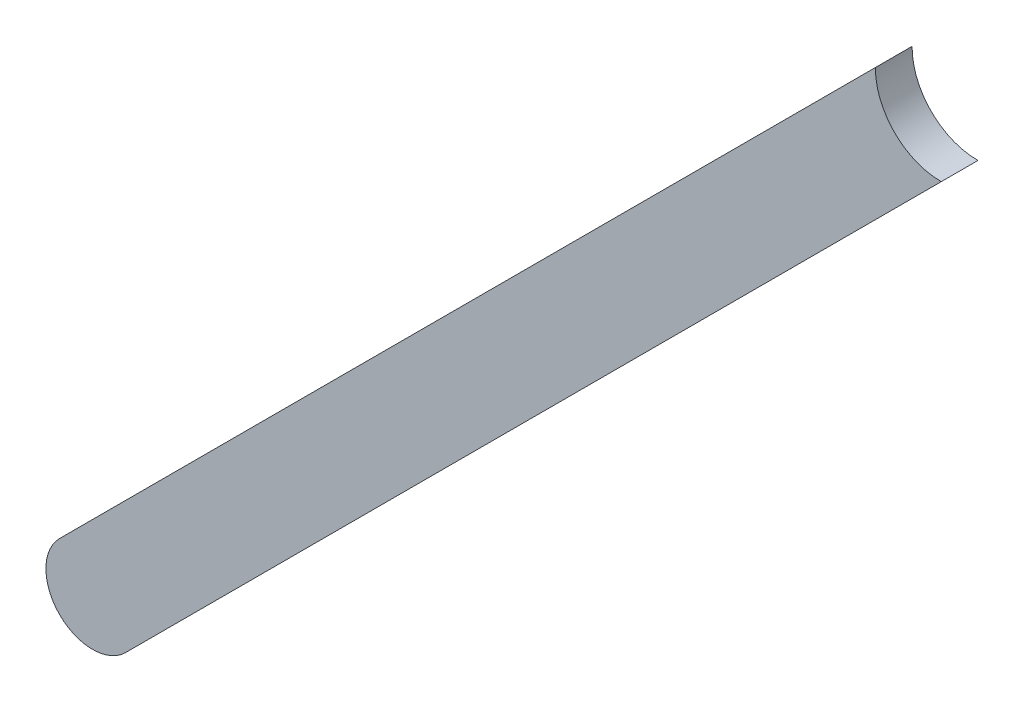
ISO-10303-21;
HEADER;
FILE_DESCRIPTION(('STEP AP214'),'2;1');
FILE_NAME('part.step','',(''),(''),'','','');
FILE_SCHEMA(('AUTOMOTIVE_DESIGN { 1 0 10303 214 1 1 1 1 }'));
ENDSEC;
DATA;
#1=APPLICATION_CONTEXT('core data for automotive mechanical design processes');
#2=APPLICATION_PROTOCOL_DEFINITION('international standard','automotive_design',2000,#1);
#3=PRODUCT_CONTEXT('',#1,'mechanical');
#4=PRODUCT('Part','Part','',(#3));
#5=PRODUCT_RELATED_PRODUCT_CATEGORY('part','',(#4));
#6=PRODUCT_DEFINITION_FORMATION('','',#4);
#7=PRODUCT_DEFINITION_CONTEXT('part definition',#1,'design');
#8=PRODUCT_DEFINITION('design','',#6,#7);
#9=PRODUCT_DEFINITION_SHAPE('','',#8);
#10=(LENGTH_UNIT() NAMED_UNIT(*) SI_UNIT(.MILLI.,.METRE.));
#11=(NAMED_UNIT(*) PLANE_ANGLE_UNIT() SI_UNIT($,.RADIAN.));
#12=(NAMED_UNIT(*) SI_UNIT($,.STERADIAN.) SOLID_ANGLE_UNIT());
#13=UNCERTAINTY_MEASURE_WITH_UNIT(LENGTH_MEASURE(1.E-05),#10,'distance_accuracy_value','');
#14=(GEOMETRIC_REPRESENTATION_CONTEXT(3) GLOBAL_UNCERTAINTY_ASSIGNED_CONTEXT((#13)) GLOBAL_UNIT_ASSIGNED_CONTEXT((#10,
#11,#12)) REPRESENTATION_CONTEXT('',''));
#15=CARTESIAN_POINT('',(0.,0.,0.));
#16=DIRECTION('',(0.,0.,1.));
#17=DIRECTION('',(1.,0.,0.));
#18=AXIS2_PLACEMENT_3D('',#15,#16,#17);
#19=CARTESIAN_POINT('',(99.77300594,63.1425966,0.));
#20=DIRECTION('',(-0.707106781186545,0.70710678118655,0.));
#21=DIRECTION('',(0.70710678118655,0.707106781186545,0.));
#22=AXIS2_PLACEMENT_3D('',#19,#20,#21);
#23=PLANE('',#22);
#24=DIRECTION('',(0.70710678118655,0.707106781186545,0.));
#25=VECTOR('',#24,1.);
#26=CARTESIAN_POINT('',(99.77300594,63.1425966,0.1999996));
#27=LINE('',#26,#25);
#28=CARTESIAN_POINT('',(99.77300594,63.1425966,0.1999996));
#29=VERTEX_POINT('',#28);
#30=CARTESIAN_POINT('',(104.219827846202,67.5894185062015,0.1999996));
#31=VERTEX_POINT('',#30);
#32=EDGE_CURVE('E11',#29,#31,#27,.T.);
#33=ORIENTED_EDGE('',*,*,#32,.F.);
#34=DIRECTION('',(0.,0.,1.));
#35=VECTOR('',#34,1.);
#36=CARTESIAN_POINT('',(99.77300594,63.1425966,0.));
#37=LINE('',#36,#35);
#38=CARTESIAN_POINT('',(99.77300594,63.1425966,0.));
#39=VERTEX_POINT('',#38);
#40=EDGE_CURVE('E24',#39,#29,#37,.T.);
#41=ORIENTED_EDGE('',*,*,#40,.F.);
#42=DIRECTION('',(0.70710678118655,0.707106781186545,0.));
#43=VECTOR('',#42,1.);
#44=CARTESIAN_POINT('',(99.77300594,63.1425966,0.));
#45=LINE('',#44,#43);
#46=CARTESIAN_POINT('',(104.219827846202,67.5894185062015,0.));
#47=VERTEX_POINT('',#46);
#48=EDGE_CURVE('E75',#39,#47,#45,.T.);
#49=ORIENTED_EDGE('',*,*,#48,.T.);
#50=DIRECTION('',(0.,0.,1.));
#51=VECTOR('',#50,1.);
#52=CARTESIAN_POINT('',(104.219827846202,67.5894185062015,0.));
#53=LINE('',#52,#51);
#54=EDGE_CURVE('E37',#47,#31,#53,.T.);
#55=ORIENTED_EDGE('',*,*,#54,.T.);
#56=EDGE_LOOP('',(#33,#41,#49,#55));
#57=FACE_BOUND('',#56,.T.);
#58=ADVANCED_FACE('F17',(#57),#23,.F.);
#59=CARTESIAN_POINT('',(104.2162,67.945,0.));
#60=DIRECTION('',(0.,0.,-1.));
#61=DIRECTION('',(1.,0.,0.));
#62=AXIS2_PLACEMENT_3D('',#59,#60,#61);
#63=CYLINDRICAL_SURFACE('',#62,0.3556);
#64=DIRECTION('',(0.,0.,1.));
#65=VECTOR('',#64,1.);
#66=CARTESIAN_POINT('',(103.860618506202,67.9486278462015,0.));
#67=LINE('',#66,#65);
#68=CARTESIAN_POINT('',(103.860618506202,67.9486278462015,0.));
#69=VERTEX_POINT('',#68);
#70=CARTESIAN_POINT('',(103.860618506202,67.9486278462015,0.1999996));
#71=VERTEX_POINT('',#70);
#72=EDGE_CURVE('E67',#69,#71,#67,.T.);
#73=ORIENTED_EDGE('',*,*,#72,.T.);
#74=CARTESIAN_POINT('',(104.2162,67.945,0.1999996));
#75=DIRECTION('',(0.,0.,1.));
#76=DIRECTION('',(1.,0.,0.));
#77=AXIS2_PLACEMENT_3D('',#74,#75,#76);
#78=CIRCLE('',#77,0.3556);
#79=EDGE_CURVE('E82',#71,#31,#78,.T.);
#80=ORIENTED_EDGE('',*,*,#79,.T.);
#81=ORIENTED_EDGE('',*,*,#54,.F.);
#82=CARTESIAN_POINT('',(104.2162,67.945,0.));
#83=DIRECTION('',(0.,0.,1.));
#84=DIRECTION('',(1.,0.,0.));
#85=AXIS2_PLACEMENT_3D('',#82,#83,#84);
#86=CIRCLE('',#85,0.3556);
#87=EDGE_CURVE('E80',#69,#47,#86,.T.);
#88=ORIENTED_EDGE('',*,*,#87,.F.);
#89=EDGE_LOOP('',(#73,#80,#81,#88));
#90=FACE_BOUND('',#89,.T.);
#91=ADVANCED_FACE('F88',(#90),#63,.F.);
#92=CARTESIAN_POINT('',(103.860618506202,67.9486278462015,0.));
#93=DIRECTION('',(0.707106781186547,-0.707106781186548,0.));
#94=DIRECTION('',(-0.707106781186548,-0.707106781186547,0.));
#95=AXIS2_PLACEMENT_3D('',#92,#93,#94);
#96=PLANE('',#95);
#97=DIRECTION('',(-0.707106781186548,-0.707106781186547,0.));
#98=VECTOR('',#97,1.);
#99=CARTESIAN_POINT('',(104.03659406,68.1246034,0.1999996));
#100=LINE('',#99,#98);
#101=CARTESIAN_POINT('',(99.4137966,63.50180594,0.1999996));
#102=VERTEX_POINT('',#101);
#103=EDGE_CURVE('E71',#71,#102,#100,.T.);
#104=ORIENTED_EDGE('',*,*,#103,.F.);
#105=ORIENTED_EDGE('',*,*,#72,.F.);
#106=DIRECTION('',(-0.707106781186548,-0.707106781186547,0.));
#107=VECTOR('',#106,1.);
#108=CARTESIAN_POINT('',(104.03659406,68.1246034,0.));
#109=LINE('',#108,#107);
#110=CARTESIAN_POINT('',(99.4137966,63.50180594,0.));
#111=VERTEX_POINT('',#110);
#112=EDGE_CURVE('E63',#69,#111,#109,.T.);
#113=ORIENTED_EDGE('',*,*,#112,.T.);
#114=DIRECTION('',(0.,0.,1.));
#115=VECTOR('',#114,1.);
#116=CARTESIAN_POINT('',(99.4137966,63.50180594,0.));
#117=LINE('',#116,#115);
#118=EDGE_CURVE('E53',#111,#102,#117,.T.);
#119=ORIENTED_EDGE('',*,*,#118,.T.);
#120=EDGE_LOOP('',(#104,#105,#113,#119));
#121=FACE_BOUND('',#120,.T.);
#122=ADVANCED_FACE('F66',(#121),#96,.F.);
#123=CARTESIAN_POINT('',(99.59340127,63.32220127,0.));
#124=DIRECTION('',(0.,0.,-1.));
#125=DIRECTION('',(-0.707106781186534,0.707106781186562,0.));
#126=AXIS2_PLACEMENT_3D('',#123,#124,#125);
#127=CYLINDRICAL_SURFACE('',#126,0.253999360179541);
#128=CARTESIAN_POINT('',(99.59340127,63.32220127,0.1999996));
#129=DIRECTION('',(0.,0.,1.));
#130=DIRECTION('',(-0.707106781186534,0.707106781186562,0.));
#131=AXIS2_PLACEMENT_3D('',#128,#129,#130);
#132=CIRCLE('',#131,0.253999360179541);
#133=EDGE_CURVE('E59',#102,#29,#132,.T.);
#134=ORIENTED_EDGE('',*,*,#133,.F.);
#135=ORIENTED_EDGE('',*,*,#118,.F.);
#136=CARTESIAN_POINT('',(99.59340127,63.32220127,0.));
#137=DIRECTION('',(0.,0.,1.));
#138=DIRECTION('',(-0.707106781186534,0.707106781186562,0.));
#139=AXIS2_PLACEMENT_3D('',#136,#137,#138);
#140=CIRCLE('',#139,0.253999360179541);
#141=EDGE_CURVE('E57',#111,#39,#140,.T.);
#142=ORIENTED_EDGE('',*,*,#141,.T.);
#143=ORIENTED_EDGE('',*,*,#40,.T.);
#144=EDGE_LOOP('',(#134,#135,#142,#143));
#145=FACE_BOUND('',#144,.T.);
#146=ADVANCED_FACE('F55',(#145),#127,.T.);
#147=CARTESIAN_POINT('',(99.77300594,63.1425966,0.));
#148=DIRECTION('',(0.,0.,-1.));
#149=DIRECTION('',(-1.,0.,0.));
#150=AXIS2_PLACEMENT_3D('',#147,#148,#149);
#151=PLANE('',#150);
#152=ORIENTED_EDGE('',*,*,#48,.F.);
#153=ORIENTED_EDGE('',*,*,#141,.F.);
#154=ORIENTED_EDGE('',*,*,#112,.F.);
#155=ORIENTED_EDGE('',*,*,#87,.T.);
#156=EDGE_LOOP('',(#152,#153,#154,#155));
#157=FACE_BOUND('',#156,.T.);
#158=ADVANCED_FACE('F74',(#157),#151,.T.);
#159=CARTESIAN_POINT('',(99.77300594,63.1425966,0.1999996));
#160=DIRECTION('',(0.,0.,-1.));
#161=DIRECTION('',(-1.,0.,0.));
#162=AXIS2_PLACEMENT_3D('',#159,#160,#161);
#163=PLANE('',#162);
#164=ORIENTED_EDGE('',*,*,#133,.T.);
#165=ORIENTED_EDGE('',*,*,#32,.T.);
#166=ORIENTED_EDGE('',*,*,#79,.F.);
#167=ORIENTED_EDGE('',*,*,#103,.T.);
#168=EDGE_LOOP('',(#164,#165,#166,#167));
#169=FACE_BOUND('',#168,.T.);
#170=ADVANCED_FACE('F91',(#169),#163,.F.);
#171=CLOSED_SHELL('',(#58,#91,#122,#146,#158,#170));
#172=MANIFOLD_SOLID_BREP('B1',#171);
#173=ADVANCED_BREP_SHAPE_REPRESENTATION('',(#18,#172),#14);
#174=SHAPE_DEFINITION_REPRESENTATION(#9,#173);
ENDSEC;
END-ISO-10303-21;
